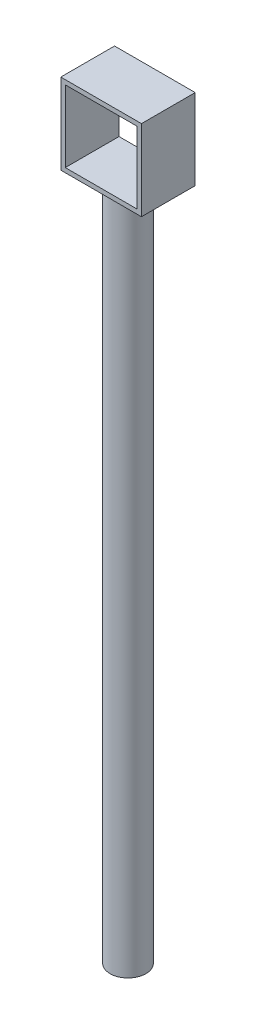
ISO-10303-21;
HEADER;
FILE_DESCRIPTION(('STEP AP214'),'2;1');
FILE_NAME('part.step','',(''),(''),'','','');
FILE_SCHEMA(('AUTOMOTIVE_DESIGN { 1 0 10303 214 1 1 1 1 }'));
ENDSEC;
DATA;
#1=APPLICATION_CONTEXT('core data for automotive mechanical design processes');
#2=APPLICATION_PROTOCOL_DEFINITION('international standard','automotive_design',2000,#1);
#3=PRODUCT_CONTEXT('',#1,'mechanical');
#4=PRODUCT('Part','Part','',(#3));
#5=PRODUCT_RELATED_PRODUCT_CATEGORY('part','',(#4));
#6=PRODUCT_DEFINITION_FORMATION('','',#4);
#7=PRODUCT_DEFINITION_CONTEXT('part definition',#1,'design');
#8=PRODUCT_DEFINITION('design','',#6,#7);
#9=PRODUCT_DEFINITION_SHAPE('','',#8);
#10=(LENGTH_UNIT() NAMED_UNIT(*) SI_UNIT(.MILLI.,.METRE.));
#11=(NAMED_UNIT(*) PLANE_ANGLE_UNIT() SI_UNIT($,.RADIAN.));
#12=(NAMED_UNIT(*) SI_UNIT($,.STERADIAN.) SOLID_ANGLE_UNIT());
#13=UNCERTAINTY_MEASURE_WITH_UNIT(LENGTH_MEASURE(1.E-05),#10,'distance_accuracy_value','');
#14=(GEOMETRIC_REPRESENTATION_CONTEXT(3) GLOBAL_UNCERTAINTY_ASSIGNED_CONTEXT((#13)) GLOBAL_UNIT_ASSIGNED_CONTEXT((#10,
#11,#12)) REPRESENTATION_CONTEXT('',''));
#15=CARTESIAN_POINT('',(0.,0.,0.));
#16=DIRECTION('',(0.,0.,1.));
#17=DIRECTION('',(1.,0.,0.));
#18=AXIS2_PLACEMENT_3D('',#15,#16,#17);
#19=CARTESIAN_POINT('',(0.,0.,38.1));
#20=DIRECTION('',(0.,0.,-1.));
#21=DIRECTION('',(-1.,0.,0.));
#22=AXIS2_PLACEMENT_3D('',#19,#20,#21);
#23=PLANE('',#22);
#24=DIRECTION('',(0.,1.,0.));
#25=VECTOR('',#24,1.);
#26=CARTESIAN_POINT('',(28.575,-28.575,38.1));
#27=LINE('',#26,#25);
#28=CARTESIAN_POINT('',(28.575,-28.575,38.1));
#29=VERTEX_POINT('',#28);
#30=CARTESIAN_POINT('',(28.575,28.575,38.1));
#31=VERTEX_POINT('',#30);
#32=EDGE_CURVE('E135',#29,#31,#27,.T.);
#33=ORIENTED_EDGE('',*,*,#32,.T.);
#34=DIRECTION('',(-1.,0.,0.));
#35=VECTOR('',#34,1.);
#36=CARTESIAN_POINT('',(-28.575,28.575,38.1));
#37=LINE('',#36,#35);
#38=CARTESIAN_POINT('',(-28.575,28.575,38.1));
#39=VERTEX_POINT('',#38);
#40=EDGE_CURVE('E138',#31,#39,#37,.T.);
#41=ORIENTED_EDGE('',*,*,#40,.T.);
#42=DIRECTION('',(0.,-1.,0.));
#43=VECTOR('',#42,1.);
#44=CARTESIAN_POINT('',(-28.575,-28.575,38.1));
#45=LINE('',#44,#43);
#46=CARTESIAN_POINT('',(-28.575,-28.575,38.1));
#47=VERTEX_POINT('',#46);
#48=EDGE_CURVE('E141',#39,#47,#45,.T.);
#49=ORIENTED_EDGE('',*,*,#48,.T.);
#50=DIRECTION('',(1.,0.,0.));
#51=VECTOR('',#50,1.);
#52=CARTESIAN_POINT('',(-28.575,-28.575,38.1));
#53=LINE('',#52,#51);
#54=EDGE_CURVE('E143',#47,#29,#53,.T.);
#55=ORIENTED_EDGE('',*,*,#54,.T.);
#56=EDGE_LOOP('',(#33,#41,#49,#55));
#57=FACE_BOUND('',#56,.T.);
#58=DIRECTION('',(0.,1.,0.));
#59=VECTOR('',#58,1.);
#60=CARTESIAN_POINT('',(25.4,-25.4,38.1));
#61=LINE('',#60,#59);
#62=CARTESIAN_POINT('',(25.4,-25.4,38.1));
#63=VERTEX_POINT('',#62);
#64=CARTESIAN_POINT('',(25.4,25.4,38.1));
#65=VERTEX_POINT('',#64);
#66=EDGE_CURVE('E98',#63,#65,#61,.T.);
#67=ORIENTED_EDGE('',*,*,#66,.F.);
#68=DIRECTION('',(1.,0.,0.));
#69=VECTOR('',#68,1.);
#70=CARTESIAN_POINT('',(-25.4,-25.4,38.1));
#71=LINE('',#70,#69);
#72=CARTESIAN_POINT('',(-25.4,-25.4,38.1));
#73=VERTEX_POINT('',#72);
#74=EDGE_CURVE('E120',#73,#63,#71,.T.);
#75=ORIENTED_EDGE('',*,*,#74,.F.);
#76=DIRECTION('',(0.,-1.,0.));
#77=VECTOR('',#76,1.);
#78=CARTESIAN_POINT('',(-25.4,-25.4,38.1));
#79=LINE('',#78,#77);
#80=CARTESIAN_POINT('',(-25.4,25.4,38.1));
#81=VERTEX_POINT('',#80);
#82=EDGE_CURVE('E118',#81,#73,#79,.T.);
#83=ORIENTED_EDGE('',*,*,#82,.F.);
#84=DIRECTION('',(-1.,0.,0.));
#85=VECTOR('',#84,1.);
#86=CARTESIAN_POINT('',(-25.4,25.4,38.1));
#87=LINE('',#86,#85);
#88=EDGE_CURVE('E106',#65,#81,#87,.T.);
#89=ORIENTED_EDGE('',*,*,#88,.F.);
#90=EDGE_LOOP('',(#67,#75,#83,#89));
#91=FACE_BOUND('',#90,.T.);
#92=ADVANCED_FACE('F32',(#57,#91),#23,.F.);
#93=CARTESIAN_POINT('',(0.,0.,0.));
#94=DIRECTION('',(0.,0.,-1.));
#95=DIRECTION('',(-1.,0.,0.));
#96=AXIS2_PLACEMENT_3D('',#93,#94,#95);
#97=PLANE('',#96);
#98=DIRECTION('',(0.,1.,0.));
#99=VECTOR('',#98,1.);
#100=CARTESIAN_POINT('',(28.575,-28.575,0.));
#101=LINE('',#100,#99);
#102=CARTESIAN_POINT('',(28.575,-28.575,0.));
#103=VERTEX_POINT('',#102);
#104=CARTESIAN_POINT('',(28.575,28.575,0.));
#105=VERTEX_POINT('',#104);
#106=EDGE_CURVE('E114',#103,#105,#101,.T.);
#107=ORIENTED_EDGE('',*,*,#106,.F.);
#108=DIRECTION('',(1.,0.,0.));
#109=VECTOR('',#108,1.);
#110=CARTESIAN_POINT('',(-28.575,-28.575,0.));
#111=LINE('',#110,#109);
#112=CARTESIAN_POINT('',(-28.575,-28.575,0.));
#113=VERTEX_POINT('',#112);
#114=EDGE_CURVE('E139',#113,#103,#111,.T.);
#115=ORIENTED_EDGE('',*,*,#114,.F.);
#116=DIRECTION('',(0.,-1.,0.));
#117=VECTOR('',#116,1.);
#118=CARTESIAN_POINT('',(-28.575,-28.575,0.));
#119=LINE('',#118,#117);
#120=CARTESIAN_POINT('',(-28.575,28.575,0.));
#121=VERTEX_POINT('',#120);
#122=EDGE_CURVE('E150',#121,#113,#119,.T.);
#123=ORIENTED_EDGE('',*,*,#122,.F.);
#124=DIRECTION('',(-1.,0.,0.));
#125=VECTOR('',#124,1.);
#126=CARTESIAN_POINT('',(-28.575,28.575,0.));
#127=LINE('',#126,#125);
#128=EDGE_CURVE('E148',#105,#121,#127,.T.);
#129=ORIENTED_EDGE('',*,*,#128,.F.);
#130=EDGE_LOOP('',(#107,#115,#123,#129));
#131=FACE_BOUND('',#130,.T.);
#132=DIRECTION('',(1.,0.,0.));
#133=VECTOR('',#132,1.);
#134=CARTESIAN_POINT('',(-25.4,-25.4,0.));
#135=LINE('',#134,#133);
#136=CARTESIAN_POINT('',(-25.4,-25.4,0.));
#137=VERTEX_POINT('',#136);
#138=CARTESIAN_POINT('',(25.4,-25.4,0.));
#139=VERTEX_POINT('',#138);
#140=EDGE_CURVE('E107',#137,#139,#135,.T.);
#141=ORIENTED_EDGE('',*,*,#140,.T.);
#142=DIRECTION('',(0.,1.,0.));
#143=VECTOR('',#142,1.);
#144=CARTESIAN_POINT('',(25.4,-25.4,0.));
#145=LINE('',#144,#143);
#146=CARTESIAN_POINT('',(25.4,25.4,0.));
#147=VERTEX_POINT('',#146);
#148=EDGE_CURVE('E56',#139,#147,#145,.T.);
#149=ORIENTED_EDGE('',*,*,#148,.T.);
#150=DIRECTION('',(-1.,0.,0.));
#151=VECTOR('',#150,1.);
#152=CARTESIAN_POINT('',(-25.4,25.4,0.));
#153=LINE('',#152,#151);
#154=CARTESIAN_POINT('',(-25.4,25.4,0.));
#155=VERTEX_POINT('',#154);
#156=EDGE_CURVE('E113',#147,#155,#153,.T.);
#157=ORIENTED_EDGE('',*,*,#156,.T.);
#158=DIRECTION('',(0.,-1.,0.));
#159=VECTOR('',#158,1.);
#160=CARTESIAN_POINT('',(-25.4,-25.4,0.));
#161=LINE('',#160,#159);
#162=EDGE_CURVE('E127',#155,#137,#161,.T.);
#163=ORIENTED_EDGE('',*,*,#162,.T.);
#164=EDGE_LOOP('',(#141,#149,#157,#163));
#165=FACE_BOUND('',#164,.T.);
#166=ADVANCED_FACE('F169',(#131,#165),#97,.T.);
#167=CARTESIAN_POINT('',(28.575,-28.575,38.1));
#168=DIRECTION('',(-1.,0.,0.));
#169=DIRECTION('',(0.,0.,1.));
#170=AXIS2_PLACEMENT_3D('',#167,#168,#169);
#171=PLANE('',#170);
#172=ORIENTED_EDGE('',*,*,#106,.T.);
#173=DIRECTION('',(0.,0.,-1.));
#174=VECTOR('',#173,1.);
#175=CARTESIAN_POINT('',(28.575,28.575,38.1));
#176=LINE('',#175,#174);
#177=EDGE_CURVE('E11',#31,#105,#176,.T.);
#178=ORIENTED_EDGE('',*,*,#177,.F.);
#179=ORIENTED_EDGE('',*,*,#32,.F.);
#180=DIRECTION('',(0.,0.,-1.));
#181=VECTOR('',#180,1.);
#182=CARTESIAN_POINT('',(28.575,-28.575,38.1));
#183=LINE('',#182,#181);
#184=EDGE_CURVE('E145',#29,#103,#183,.T.);
#185=ORIENTED_EDGE('',*,*,#184,.T.);
#186=EDGE_LOOP('',(#172,#178,#179,#185));
#187=FACE_BOUND('',#186,.T.);
#188=ADVANCED_FACE('F34',(#187),#171,.F.);
#189=CARTESIAN_POINT('',(-28.575,28.575,38.1));
#190=DIRECTION('',(0.,-1.,0.));
#191=DIRECTION('',(0.,0.,-1.));
#192=AXIS2_PLACEMENT_3D('',#189,#190,#191);
#193=PLANE('',#192);
#194=ORIENTED_EDGE('',*,*,#128,.T.);
#195=DIRECTION('',(0.,0.,-1.));
#196=VECTOR('',#195,1.);
#197=CARTESIAN_POINT('',(-28.575,28.575,38.1));
#198=LINE('',#197,#196);
#199=EDGE_CURVE('E41',#39,#121,#198,.T.);
#200=ORIENTED_EDGE('',*,*,#199,.F.);
#201=ORIENTED_EDGE('',*,*,#40,.F.);
#202=ORIENTED_EDGE('',*,*,#177,.T.);
#203=EDGE_LOOP('',(#194,#200,#201,#202));
#204=FACE_BOUND('',#203,.T.);
#205=ADVANCED_FACE('F179',(#204),#193,.F.);
#206=CARTESIAN_POINT('',(-28.575,-28.575,38.1));
#207=DIRECTION('',(1.,0.,0.));
#208=DIRECTION('',(0.,0.,-1.));
#209=AXIS2_PLACEMENT_3D('',#206,#207,#208);
#210=PLANE('',#209);
#211=ORIENTED_EDGE('',*,*,#122,.T.);
#212=DIRECTION('',(0.,0.,-1.));
#213=VECTOR('',#212,1.);
#214=CARTESIAN_POINT('',(-28.575,-28.575,38.1));
#215=LINE('',#214,#213);
#216=EDGE_CURVE('E155',#47,#113,#215,.T.);
#217=ORIENTED_EDGE('',*,*,#216,.F.);
#218=ORIENTED_EDGE('',*,*,#48,.F.);
#219=ORIENTED_EDGE('',*,*,#199,.T.);
#220=EDGE_LOOP('',(#211,#217,#218,#219));
#221=FACE_BOUND('',#220,.T.);
#222=ADVANCED_FACE('F163',(#221),#210,.F.);
#223=CARTESIAN_POINT('',(-28.575,-28.575,38.1));
#224=DIRECTION('',(0.,1.,0.));
#225=DIRECTION('',(0.,0.,1.));
#226=AXIS2_PLACEMENT_3D('',#223,#224,#225);
#227=PLANE('',#226);
#228=CARTESIAN_POINT('',(0.,-28.575,19.05));
#229=DIRECTION('',(0.,1.,0.));
#230=DIRECTION('',(0.,0.,1.));
#231=AXIS2_PLACEMENT_3D('',#228,#229,#230);
#232=CIRCLE('',#231,12.7);
#233=CARTESIAN_POINT('',(0.,-28.5750000000001,31.75));
#234=VERTEX_POINT('',#233);
#235=EDGE_CURVE('E36',#234,#234,#232,.T.);
#236=ORIENTED_EDGE('',*,*,#235,.T.);
#237=EDGE_LOOP('',(#236));
#238=FACE_BOUND('',#237,.T.);
#239=ORIENTED_EDGE('',*,*,#114,.T.);
#240=ORIENTED_EDGE('',*,*,#184,.F.);
#241=ORIENTED_EDGE('',*,*,#54,.F.);
#242=ORIENTED_EDGE('',*,*,#216,.T.);
#243=EDGE_LOOP('',(#239,#240,#241,#242));
#244=FACE_BOUND('',#243,.T.);
#245=ADVANCED_FACE('F173',(#238,#244),#227,.F.);
#246=CARTESIAN_POINT('',(25.4,-25.4,38.1));
#247=DIRECTION('',(-1.,0.,0.));
#248=DIRECTION('',(0.,0.,1.));
#249=AXIS2_PLACEMENT_3D('',#246,#247,#248);
#250=PLANE('',#249);
#251=ORIENTED_EDGE('',*,*,#148,.F.);
#252=DIRECTION('',(0.,0.,-1.));
#253=VECTOR('',#252,1.);
#254=CARTESIAN_POINT('',(25.4,-25.4,38.1));
#255=LINE('',#254,#253);
#256=EDGE_CURVE('E102',#63,#139,#255,.T.);
#257=ORIENTED_EDGE('',*,*,#256,.F.);
#258=ORIENTED_EDGE('',*,*,#66,.T.);
#259=DIRECTION('',(0.,0.,-1.));
#260=VECTOR('',#259,1.);
#261=CARTESIAN_POINT('',(25.4,25.4,38.1));
#262=LINE('',#261,#260);
#263=EDGE_CURVE('E101',#65,#147,#262,.T.);
#264=ORIENTED_EDGE('',*,*,#263,.T.);
#265=EDGE_LOOP('',(#251,#257,#258,#264));
#266=FACE_BOUND('',#265,.T.);
#267=ADVANCED_FACE('F100',(#266),#250,.T.);
#268=CARTESIAN_POINT('',(-25.4,25.4,38.1));
#269=DIRECTION('',(0.,-1.,0.));
#270=DIRECTION('',(0.,0.,-1.));
#271=AXIS2_PLACEMENT_3D('',#268,#269,#270);
#272=PLANE('',#271);
#273=ORIENTED_EDGE('',*,*,#156,.F.);
#274=ORIENTED_EDGE('',*,*,#263,.F.);
#275=ORIENTED_EDGE('',*,*,#88,.T.);
#276=DIRECTION('',(0.,0.,-1.));
#277=VECTOR('',#276,1.);
#278=CARTESIAN_POINT('',(-25.4,25.4,38.1));
#279=LINE('',#278,#277);
#280=EDGE_CURVE('E115',#81,#155,#279,.T.);
#281=ORIENTED_EDGE('',*,*,#280,.T.);
#282=EDGE_LOOP('',(#273,#274,#275,#281));
#283=FACE_BOUND('',#282,.T.);
#284=ADVANCED_FACE('F110',(#283),#272,.T.);
#285=CARTESIAN_POINT('',(-25.4,-25.4,38.1));
#286=DIRECTION('',(1.,0.,0.));
#287=DIRECTION('',(0.,0.,-1.));
#288=AXIS2_PLACEMENT_3D('',#285,#286,#287);
#289=PLANE('',#288);
#290=ORIENTED_EDGE('',*,*,#162,.F.);
#291=ORIENTED_EDGE('',*,*,#280,.F.);
#292=ORIENTED_EDGE('',*,*,#82,.T.);
#293=DIRECTION('',(0.,0.,-1.));
#294=VECTOR('',#293,1.);
#295=CARTESIAN_POINT('',(-25.4,-25.4,38.1));
#296=LINE('',#295,#294);
#297=EDGE_CURVE('E48',#73,#137,#296,.T.);
#298=ORIENTED_EDGE('',*,*,#297,.T.);
#299=EDGE_LOOP('',(#290,#291,#292,#298));
#300=FACE_BOUND('',#299,.T.);
#301=ADVANCED_FACE('F220',(#300),#289,.T.);
#302=CARTESIAN_POINT('',(-25.4,-25.4,38.1));
#303=DIRECTION('',(0.,1.,0.));
#304=DIRECTION('',(0.,0.,1.));
#305=AXIS2_PLACEMENT_3D('',#302,#303,#304);
#306=PLANE('',#305);
#307=ORIENTED_EDGE('',*,*,#140,.F.);
#308=ORIENTED_EDGE('',*,*,#297,.F.);
#309=ORIENTED_EDGE('',*,*,#74,.T.);
#310=ORIENTED_EDGE('',*,*,#256,.T.);
#311=EDGE_LOOP('',(#307,#308,#309,#310));
#312=FACE_BOUND('',#311,.T.);
#313=ADVANCED_FACE('F215',(#312),#306,.T.);
#314=CARTESIAN_POINT('',(0.,-510.54,19.05));
#315=DIRECTION('',(0.,1.,0.));
#316=DIRECTION('',(0.,0.,1.));
#317=AXIS2_PLACEMENT_3D('',#314,#315,#316);
#318=CYLINDRICAL_SURFACE('',#317,12.7);
#319=CARTESIAN_POINT('',(0.,-510.54,19.05));
#320=DIRECTION('',(0.,1.,0.));
#321=DIRECTION('',(0.,0.,1.));
#322=AXIS2_PLACEMENT_3D('',#319,#320,#321);
#323=CIRCLE('',#322,12.7);
#324=CARTESIAN_POINT('',(0.,-510.54,31.75));
#325=VERTEX_POINT('',#324);
#326=EDGE_CURVE('E203',#325,#325,#323,.T.);
#327=CARTESIAN_POINT('',(0.,-510.54,31.75));
#328=CARTESIAN_POINT('',(0.,-505.51953125,31.75));
#329=CARTESIAN_POINT('',(0.,-500.4990625,31.75));
#330=CARTESIAN_POINT('',(0.,-490.458125,31.75));
#331=CARTESIAN_POINT('',(0.,-485.43765625,31.75));
#332=CARTESIAN_POINT('',(0.,-475.39671875,31.75));
#333=CARTESIAN_POINT('',(0.,-470.37625,31.75));
#334=CARTESIAN_POINT('',(0.,-460.3353125,31.75));
#335=CARTESIAN_POINT('',(0.,-455.31484375,31.75));
#336=CARTESIAN_POINT('',(0.,-445.27390625,31.75));
#337=CARTESIAN_POINT('',(0.,-440.2534375,31.75));
#338=CARTESIAN_POINT('',(0.,-430.2125,31.75));
#339=CARTESIAN_POINT('',(0.,-425.19203125,31.75));
#340=CARTESIAN_POINT('',(0.,-415.15109375,31.75));
#341=CARTESIAN_POINT('',(0.,-410.130625,31.75));
#342=CARTESIAN_POINT('',(0.,-400.0896875,31.75));
#343=CARTESIAN_POINT('',(0.,-395.06921875,31.75));
#344=CARTESIAN_POINT('',(0.,-385.02828125,31.75));
#345=CARTESIAN_POINT('',(0.,-380.0078125,31.75));
#346=CARTESIAN_POINT('',(0.,-369.966875,31.75));
#347=CARTESIAN_POINT('',(0.,-364.94640625,31.75));
#348=CARTESIAN_POINT('',(0.,-354.90546875,31.75));
#349=CARTESIAN_POINT('',(0.,-349.885,31.75));
#350=CARTESIAN_POINT('',(0.,-339.8440625,31.75));
#351=CARTESIAN_POINT('',(0.,-334.82359375,31.75));
#352=CARTESIAN_POINT('',(0.,-324.78265625,31.75));
#353=CARTESIAN_POINT('',(0.,-319.7621875,31.75));
#354=CARTESIAN_POINT('',(0.,-309.72125,31.75));
#355=CARTESIAN_POINT('',(0.,-304.70078125,31.75));
#356=CARTESIAN_POINT('',(0.,-294.65984375,31.75));
#357=CARTESIAN_POINT('',(0.,-289.639375,31.75));
#358=CARTESIAN_POINT('',(0.,-279.5984375,31.75));
#359=CARTESIAN_POINT('',(0.,-274.57796875,31.75));
#360=CARTESIAN_POINT('',(0.,-264.53703125,31.75));
#361=CARTESIAN_POINT('',(0.,-259.5165625,31.75));
#362=CARTESIAN_POINT('',(0.,-249.475625,31.75));
#363=CARTESIAN_POINT('',(0.,-244.45515625,31.75));
#364=CARTESIAN_POINT('',(0.,-234.41421875,31.75));
#365=CARTESIAN_POINT('',(0.,-229.39375,31.75));
#366=CARTESIAN_POINT('',(0.,-219.3528125,31.75));
#367=CARTESIAN_POINT('',(0.,-214.33234375,31.75));
#368=CARTESIAN_POINT('',(0.,-204.29140625,31.75));
#369=CARTESIAN_POINT('',(0.,-199.2709375,31.75));
#370=CARTESIAN_POINT('',(0.,-189.23,31.75));
#371=CARTESIAN_POINT('',(0.,-184.20953125,31.75));
#372=CARTESIAN_POINT('',(0.,-174.16859375,31.75));
#373=CARTESIAN_POINT('',(0.,-169.148125,31.75));
#374=CARTESIAN_POINT('',(0.,-159.1071875,31.75));
#375=CARTESIAN_POINT('',(0.,-154.08671875,31.75));
#376=CARTESIAN_POINT('',(0.,-144.04578125,31.75));
#377=CARTESIAN_POINT('',(0.,-139.0253125,31.75));
#378=CARTESIAN_POINT('',(0.,-128.984375,31.75));
#379=CARTESIAN_POINT('',(0.,-123.96390625,31.75));
#380=CARTESIAN_POINT('',(0.,-113.92296875,31.75));
#381=CARTESIAN_POINT('',(0.,-108.9025,31.75));
#382=CARTESIAN_POINT('',(0.,-98.8615625000001,31.75));
#383=CARTESIAN_POINT('',(0.,-93.8410937500001,31.75));
#384=CARTESIAN_POINT('',(0.,-83.8001562500001,31.75));
#385=CARTESIAN_POINT('',(0.,-78.7796875000001,31.75));
#386=CARTESIAN_POINT('',(0.,-68.7387500000001,31.75));
#387=CARTESIAN_POINT('',(0.,-63.7182812500001,31.75));
#388=CARTESIAN_POINT('',(0.,-53.6773437500001,31.75));
#389=CARTESIAN_POINT('',(0.,-48.6568750000001,31.75));
#390=CARTESIAN_POINT('',(0.,-38.6159375000001,31.75));
#391=CARTESIAN_POINT('',(0.,-33.5954687500001,31.75));
#392=CARTESIAN_POINT('',(0.,-28.5750000000001,31.75));
#393=B_SPLINE_CURVE_WITH_KNOTS('',3,(#327,#328,#329,#330,#331,#332,#333,#334,#335,#336,#337,
#338,#339,#340,#341,#342,#343,#344,#345,#346,#347,#348,#349,#350,#351,#352,#353,#354,#355,#356,
#357,#358,#359,#360,#361,#362,#363,#364,#365,#366,#367,#368,#369,#370,#371,#372,#373,#374,#375,
#376,#377,#378,#379,#380,#381,#382,#383,#384,#385,#386,#387,#388,#389,#390,#391,#392),
.UNSPECIFIED.,.F.,.F.,(4,2,2,2,2,2,2,2,2,2,2,2,2,2,2,2,2,2,2,2,2,2,2,2,2,2,2,2,2,2,2,2,4),(0.,
15.0614062500001,30.1228125,45.1842187500001,60.2456250000001,75.3070312500001,90.3684375000001,
105.42984375,120.49125,135.55265625,150.6140625,165.67546875,180.736875,195.79828125,
210.8596875,225.92109375,240.9825,256.04390625,271.1053125,286.16671875,301.228125,316.28953125,
331.3509375,346.41234375,361.47375,376.53515625,391.5965625,406.65796875,421.719375,
436.78078125,451.8421875,466.90359375,481.965),.UNSPECIFIED.);
#394=EDGE_CURVE('BSEAM207',#325,#234,#393,.T.);
#395=ORIENTED_EDGE('',*,*,#326,.T.);
#396=ORIENTED_EDGE('',*,*,#235,.F.);
#397=ORIENTED_EDGE('',*,*,#394,.T.);
#398=ORIENTED_EDGE('',*,*,#394,.F.);
#399=EDGE_LOOP('',(#395,#397,#396,#398));
#400=FACE_BOUND('',#399,.T.);
#401=ADVANCED_FACE('F207',(#400),#318,.T.);
#402=CARTESIAN_POINT('',(0.,-510.54,19.05));
#403=DIRECTION('',(0.,1.,0.));
#404=DIRECTION('',(0.,0.,1.));
#405=AXIS2_PLACEMENT_3D('',#402,#403,#404);
#406=PLANE('',#405);
#407=ORIENTED_EDGE('',*,*,#326,.F.);
#408=EDGE_LOOP('',(#407));
#409=FACE_BOUND('',#408,.T.);
#410=ADVANCED_FACE('F209',(#409),#406,.F.);
#411=CLOSED_SHELL('',(#92,#166,#188,#205,#222,#245,#267,#284,#301,#313,#401,#410));
#412=MANIFOLD_SOLID_BREP('B2',#411);
#413=ADVANCED_BREP_SHAPE_REPRESENTATION('',(#18,#412),#14);
#414=SHAPE_DEFINITION_REPRESENTATION(#9,#413);
ENDSEC;
END-ISO-10303-21;
